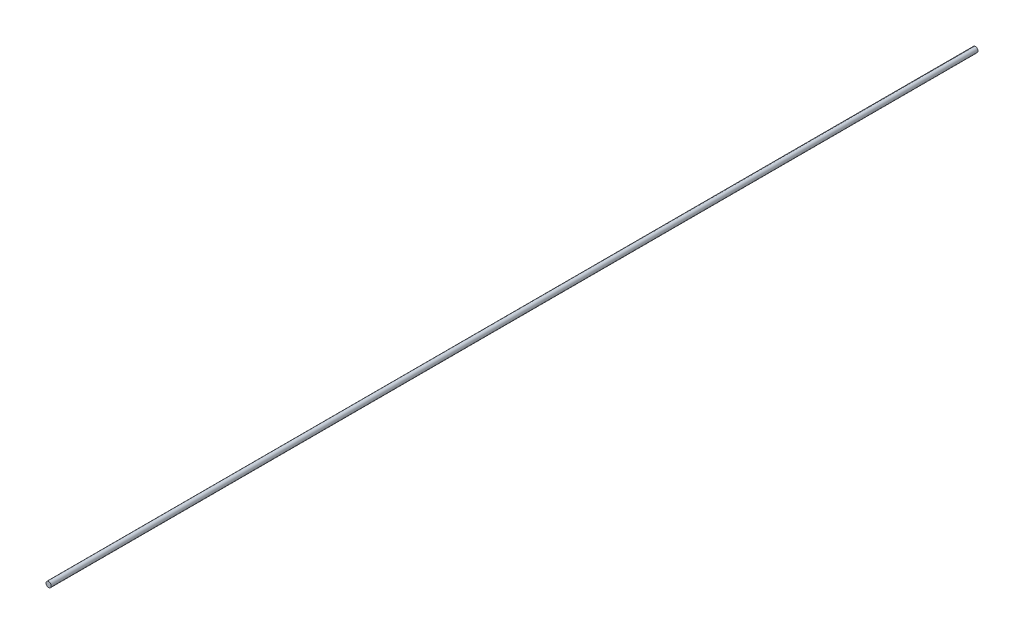
ISO-10303-21;
HEADER;
FILE_DESCRIPTION(('STEP AP214'),'2;1');
FILE_NAME('part.step','',(''),(''),'','','');
FILE_SCHEMA(('AUTOMOTIVE_DESIGN { 1 0 10303 214 1 1 1 1 }'));
ENDSEC;
DATA;
#1=APPLICATION_CONTEXT('core data for automotive mechanical design processes');
#2=APPLICATION_PROTOCOL_DEFINITION('international standard','automotive_design',2000,#1);
#3=PRODUCT_CONTEXT('',#1,'mechanical');
#4=PRODUCT('Part','Part','',(#3));
#5=PRODUCT_RELATED_PRODUCT_CATEGORY('part','',(#4));
#6=PRODUCT_DEFINITION_FORMATION('','',#4);
#7=PRODUCT_DEFINITION_CONTEXT('part definition',#1,'design');
#8=PRODUCT_DEFINITION('design','',#6,#7);
#9=PRODUCT_DEFINITION_SHAPE('','',#8);
#10=(LENGTH_UNIT() NAMED_UNIT(*) SI_UNIT(.MILLI.,.METRE.));
#11=(NAMED_UNIT(*) PLANE_ANGLE_UNIT() SI_UNIT($,.RADIAN.));
#12=(NAMED_UNIT(*) SI_UNIT($,.STERADIAN.) SOLID_ANGLE_UNIT());
#13=UNCERTAINTY_MEASURE_WITH_UNIT(LENGTH_MEASURE(1.E-05),#10,'distance_accuracy_value','');
#14=(GEOMETRIC_REPRESENTATION_CONTEXT(3) GLOBAL_UNCERTAINTY_ASSIGNED_CONTEXT((#13)) GLOBAL_UNIT_ASSIGNED_CONTEXT((#10,
#11,#12)) REPRESENTATION_CONTEXT('',''));
#15=CARTESIAN_POINT('',(0.,0.,0.));
#16=DIRECTION('',(0.,0.,1.));
#17=DIRECTION('',(1.,0.,0.));
#18=AXIS2_PLACEMENT_3D('',#15,#16,#17);
#19=CARTESIAN_POINT('',(0.,0.,4491.96355273401));
#20=DIRECTION('',(0.,0.,-1.));
#21=DIRECTION('',(-1.,0.,0.));
#22=AXIS2_PLACEMENT_3D('',#19,#20,#21);
#23=CYLINDRICAL_SURFACE('',#22,12.7);
#24=CARTESIAN_POINT('',(0.,0.,4491.96355273401));
#25=DIRECTION('',(0.,0.,1.));
#26=DIRECTION('',(1.,0.,0.));
#27=AXIS2_PLACEMENT_3D('',#24,#25,#26);
#28=CIRCLE('',#27,12.7);
#29=CARTESIAN_POINT('',(12.7,0.,4491.96355273401));
#30=VERTEX_POINT('',#29);
#31=EDGE_CURVE('E10',#30,#30,#28,.T.);
#32=ORIENTED_EDGE('',*,*,#31,.F.);
#33=EDGE_LOOP('',(#32));
#34=FACE_BOUND('',#33,.T.);
#35=CARTESIAN_POINT('',(0.,0.,0.));
#36=DIRECTION('',(0.,0.,1.));
#37=DIRECTION('',(1.,0.,0.));
#38=AXIS2_PLACEMENT_3D('',#35,#36,#37);
#39=CIRCLE('',#38,12.7);
#40=CARTESIAN_POINT('',(12.7,0.,0.));
#41=VERTEX_POINT('',#40);
#42=EDGE_CURVE('E44',#41,#41,#39,.T.);
#43=ORIENTED_EDGE('',*,*,#42,.T.);
#44=EDGE_LOOP('',(#43));
#45=FACE_BOUND('',#44,.T.);
#46=ADVANCED_FACE('F45',(#34,#45),#23,.T.);
#47=CARTESIAN_POINT('',(0.,0.,4491.96355273401));
#48=DIRECTION('',(0.,0.,1.));
#49=DIRECTION('',(1.,0.,0.));
#50=AXIS2_PLACEMENT_3D('',#47,#48,#49);
#51=PLANE('',#50);
#52=ORIENTED_EDGE('',*,*,#31,.T.);
#53=EDGE_LOOP('',(#52));
#54=FACE_BOUND('',#53,.T.);
#55=ADVANCED_FACE('F60',(#54),#51,.T.);
#56=CARTESIAN_POINT('',(0.,0.,0.));
#57=DIRECTION('',(0.,0.,1.));
#58=DIRECTION('',(1.,0.,0.));
#59=AXIS2_PLACEMENT_3D('',#56,#57,#58);
#60=PLANE('',#59);
#61=ORIENTED_EDGE('',*,*,#42,.F.);
#62=EDGE_LOOP('',(#61));
#63=FACE_BOUND('',#62,.T.);
#64=ADVANCED_FACE('F54',(#63),#60,.F.);
#65=CLOSED_SHELL('',(#46,#55,#64));
#66=MANIFOLD_SOLID_BREP('B2',#65);
#67=ADVANCED_BREP_SHAPE_REPRESENTATION('',(#18,#66),#14);
#68=SHAPE_DEFINITION_REPRESENTATION(#9,#67);
ENDSEC;
END-ISO-10303-21;
